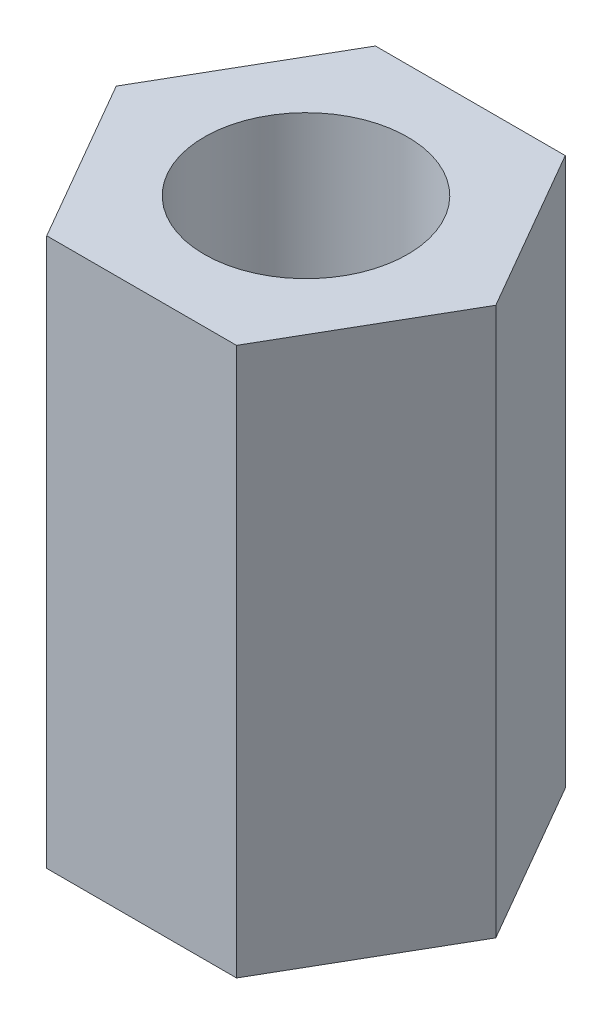
ISO-10303-21;
HEADER;
FILE_DESCRIPTION(('STEP AP214'),'2;1');
FILE_NAME('part.step','',(''),(''),'','','');
FILE_SCHEMA(('AUTOMOTIVE_DESIGN { 1 0 10303 214 1 1 1 1 }'));
ENDSEC;
DATA;
#1=APPLICATION_CONTEXT('core data for automotive mechanical design processes');
#2=APPLICATION_PROTOCOL_DEFINITION('international standard','automotive_design',2000,#1);
#3=PRODUCT_CONTEXT('',#1,'mechanical');
#4=PRODUCT('Part','Part','',(#3));
#5=PRODUCT_RELATED_PRODUCT_CATEGORY('part','',(#4));
#6=PRODUCT_DEFINITION_FORMATION('','',#4);
#7=PRODUCT_DEFINITION_CONTEXT('part definition',#1,'design');
#8=PRODUCT_DEFINITION('design','',#6,#7);
#9=PRODUCT_DEFINITION_SHAPE('','',#8);
#10=(LENGTH_UNIT() NAMED_UNIT(*) SI_UNIT(.MILLI.,.METRE.));
#11=(NAMED_UNIT(*) PLANE_ANGLE_UNIT() SI_UNIT($,.RADIAN.));
#12=(NAMED_UNIT(*) SI_UNIT($,.STERADIAN.) SOLID_ANGLE_UNIT());
#13=UNCERTAINTY_MEASURE_WITH_UNIT(LENGTH_MEASURE(1.E-05),#10,'distance_accuracy_value','');
#14=(GEOMETRIC_REPRESENTATION_CONTEXT(3) GLOBAL_UNCERTAINTY_ASSIGNED_CONTEXT((#13)) GLOBAL_UNIT_ASSIGNED_CONTEXT((#10,
#11,#12)) REPRESENTATION_CONTEXT('',''));
#15=CARTESIAN_POINT('',(0.,0.,0.));
#16=DIRECTION('',(0.,0.,1.));
#17=DIRECTION('',(1.,0.,0.));
#18=AXIS2_PLACEMENT_3D('',#15,#16,#17);
#19=CARTESIAN_POINT('',(1.37481532850778,7.9375,2.38125000000001));
#20=DIRECTION('',(-0.866025403784439,0.,-0.499999999999999));
#21=DIRECTION('',(-0.499999999999999,0.,0.866025403784439));
#22=AXIS2_PLACEMENT_3D('',#19,#20,#21);
#23=PLANE('',#22);
#24=DIRECTION('',(0.499999999999999,0.,-0.866025403784439));
#25=VECTOR('',#24,1.);
#26=CARTESIAN_POINT('',(1.37481532850778,0.,2.38125000000001));
#27=LINE('',#26,#25);
#28=CARTESIAN_POINT('',(1.37481532850778,0.,2.38125000000001));
#29=VERTEX_POINT('',#28);
#30=CARTESIAN_POINT('',(2.74963065701558,0.,0.));
#31=VERTEX_POINT('',#30);
#32=EDGE_CURVE('E117',#29,#31,#27,.T.);
#33=ORIENTED_EDGE('',*,*,#32,.T.);
#34=DIRECTION('',(0.,-1.,0.));
#35=VECTOR('',#34,1.);
#36=CARTESIAN_POINT('',(2.74963065701558,7.9375,0.));
#37=LINE('',#36,#35);
#38=CARTESIAN_POINT('',(2.74963065701558,7.9375,0.));
#39=VERTEX_POINT('',#38);
#40=EDGE_CURVE('E11',#39,#31,#37,.T.);
#41=ORIENTED_EDGE('',*,*,#40,.F.);
#42=DIRECTION('',(0.499999999999999,0.,-0.866025403784439));
#43=VECTOR('',#42,1.);
#44=CARTESIAN_POINT('',(1.37481532850778,7.9375,2.38125000000001));
#45=LINE('',#44,#43);
#46=CARTESIAN_POINT('',(1.37481532850778,7.9375,2.38125000000001));
#47=VERTEX_POINT('',#46);
#48=EDGE_CURVE('E128',#47,#39,#45,.T.);
#49=ORIENTED_EDGE('',*,*,#48,.F.);
#50=DIRECTION('',(0.,-1.,0.));
#51=VECTOR('',#50,1.);
#52=CARTESIAN_POINT('',(1.37481532850778,7.9375,2.38125000000001));
#53=LINE('',#52,#51);
#54=EDGE_CURVE('E113',#47,#29,#53,.T.);
#55=ORIENTED_EDGE('',*,*,#54,.T.);
#56=EDGE_LOOP('',(#33,#41,#49,#55));
#57=FACE_BOUND('',#56,.T.);
#58=ADVANCED_FACE('F33',(#57),#23,.F.);
#59=CARTESIAN_POINT('',(2.74963065701558,7.9375,0.));
#60=DIRECTION('',(-0.866025403784439,0.,0.5));
#61=DIRECTION('',(0.5,0.,0.866025403784439));
#62=AXIS2_PLACEMENT_3D('',#59,#60,#61);
#63=PLANE('',#62);
#64=DIRECTION('',(-0.5,0.,-0.866025403784439));
#65=VECTOR('',#64,1.);
#66=CARTESIAN_POINT('',(2.74963065701558,0.,0.));
#67=LINE('',#66,#65);
#68=CARTESIAN_POINT('',(1.37481532850778,0.,-2.38125000000002));
#69=VERTEX_POINT('',#68);
#70=EDGE_CURVE('E120',#31,#69,#67,.T.);
#71=ORIENTED_EDGE('',*,*,#70,.T.);
#72=DIRECTION('',(0.,-1.,0.));
#73=VECTOR('',#72,1.);
#74=CARTESIAN_POINT('',(1.37481532850778,7.9375,-2.38125000000002));
#75=LINE('',#74,#73);
#76=CARTESIAN_POINT('',(1.37481532850778,7.9375,-2.38125000000002));
#77=VERTEX_POINT('',#76);
#78=EDGE_CURVE('E41',#77,#69,#75,.T.);
#79=ORIENTED_EDGE('',*,*,#78,.F.);
#80=DIRECTION('',(-0.5,0.,-0.866025403784439));
#81=VECTOR('',#80,1.);
#82=CARTESIAN_POINT('',(2.74963065701558,7.9375,0.));
#83=LINE('',#82,#81);
#84=EDGE_CURVE('E86',#39,#77,#83,.T.);
#85=ORIENTED_EDGE('',*,*,#84,.F.);
#86=ORIENTED_EDGE('',*,*,#40,.T.);
#87=EDGE_LOOP('',(#71,#79,#85,#86));
#88=FACE_BOUND('',#87,.T.);
#89=ADVANCED_FACE('F153',(#88),#63,.F.);
#90=CARTESIAN_POINT('',(1.37481532850778,7.9375,-2.38125000000002));
#91=DIRECTION('',(0.,0.,1.));
#92=DIRECTION('',(1.,0.,0.));
#93=AXIS2_PLACEMENT_3D('',#90,#91,#92);
#94=PLANE('',#93);
#95=DIRECTION('',(-1.,0.,0.));
#96=VECTOR('',#95,1.);
#97=CARTESIAN_POINT('',(1.37481532850778,0.,-2.38125000000002));
#98=LINE('',#97,#96);
#99=CARTESIAN_POINT('',(-1.3748153285078,0.,-2.38125000000003));
#100=VERTEX_POINT('',#99);
#101=EDGE_CURVE('E123',#69,#100,#98,.T.);
#102=ORIENTED_EDGE('',*,*,#101,.T.);
#103=DIRECTION('',(0.,-1.,0.));
#104=VECTOR('',#103,1.);
#105=CARTESIAN_POINT('',(-1.3748153285078,7.9375,-2.38125000000003));
#106=LINE('',#105,#104);
#107=CARTESIAN_POINT('',(-1.3748153285078,7.9375,-2.38125000000003));
#108=VERTEX_POINT('',#107);
#109=EDGE_CURVE('E108',#108,#100,#106,.T.);
#110=ORIENTED_EDGE('',*,*,#109,.F.);
#111=DIRECTION('',(-1.,0.,0.));
#112=VECTOR('',#111,1.);
#113=CARTESIAN_POINT('',(1.37481532850778,7.9375,-2.38125000000002));
#114=LINE('',#113,#112);
#115=EDGE_CURVE('E99',#77,#108,#114,.T.);
#116=ORIENTED_EDGE('',*,*,#115,.F.);
#117=ORIENTED_EDGE('',*,*,#78,.T.);
#118=EDGE_LOOP('',(#102,#110,#116,#117));
#119=FACE_BOUND('',#118,.T.);
#120=ADVANCED_FACE('F134',(#119),#94,.F.);
#121=CARTESIAN_POINT('',(-1.3748153285078,7.9375,-2.38125000000003));
#122=DIRECTION('',(0.86602540378444,0.,0.499999999999999));
#123=DIRECTION('',(0.499999999999999,0.,-0.86602540378444));
#124=AXIS2_PLACEMENT_3D('',#121,#122,#123);
#125=PLANE('',#124);
#126=DIRECTION('',(-0.499999999999999,0.,0.866025403784439));
#127=VECTOR('',#126,1.);
#128=CARTESIAN_POINT('',(-1.3748153285078,0.,-2.38125000000003));
#129=LINE('',#128,#127);
#130=CARTESIAN_POINT('',(-2.7496306570156,0.,0.));
#131=VERTEX_POINT('',#130);
#132=EDGE_CURVE('E107',#100,#131,#129,.T.);
#133=ORIENTED_EDGE('',*,*,#132,.T.);
#134=DIRECTION('',(0.,-1.,0.));
#135=VECTOR('',#134,1.);
#136=CARTESIAN_POINT('',(-2.7496306570156,7.9375,0.));
#137=LINE('',#136,#135);
#138=CARTESIAN_POINT('',(-2.7496306570156,7.9375,0.));
#139=VERTEX_POINT('',#138);
#140=EDGE_CURVE('E104',#139,#131,#137,.T.);
#141=ORIENTED_EDGE('',*,*,#140,.F.);
#142=DIRECTION('',(-0.499999999999999,0.,0.866025403784439));
#143=VECTOR('',#142,1.);
#144=CARTESIAN_POINT('',(-1.3748153285078,7.9375,-2.38125000000003));
#145=LINE('',#144,#143);
#146=EDGE_CURVE('E93',#108,#139,#145,.T.);
#147=ORIENTED_EDGE('',*,*,#146,.F.);
#148=ORIENTED_EDGE('',*,*,#109,.T.);
#149=EDGE_LOOP('',(#133,#141,#147,#148));
#150=FACE_BOUND('',#149,.T.);
#151=ADVANCED_FACE('F105',(#150),#125,.F.);
#152=CARTESIAN_POINT('',(-2.7496306570156,7.9375,0.));
#153=DIRECTION('',(0.866025403784438,0.,-0.500000000000001));
#154=DIRECTION('',(-0.500000000000001,0.,-0.866025403784438));
#155=AXIS2_PLACEMENT_3D('',#152,#153,#154);
#156=PLANE('',#155);
#157=DIRECTION('',(0.500000000000001,0.,0.866025403784438));
#158=VECTOR('',#157,1.);
#159=CARTESIAN_POINT('',(-2.7496306570156,0.,0.));
#160=LINE('',#159,#158);
#161=CARTESIAN_POINT('',(-1.3748153285078,0.,2.38125000000001));
#162=VERTEX_POINT('',#161);
#163=EDGE_CURVE('E72',#131,#162,#160,.T.);
#164=ORIENTED_EDGE('',*,*,#163,.T.);
#165=DIRECTION('',(0.,-1.,0.));
#166=VECTOR('',#165,1.);
#167=CARTESIAN_POINT('',(-1.3748153285078,7.9375,2.38125000000001));
#168=LINE('',#167,#166);
#169=CARTESIAN_POINT('',(-1.3748153285078,7.9375,2.38125000000001));
#170=VERTEX_POINT('',#169);
#171=EDGE_CURVE('E109',#170,#162,#168,.T.);
#172=ORIENTED_EDGE('',*,*,#171,.F.);
#173=DIRECTION('',(0.500000000000001,0.,0.866025403784438));
#174=VECTOR('',#173,1.);
#175=CARTESIAN_POINT('',(-2.7496306570156,7.9375,0.));
#176=LINE('',#175,#174);
#177=EDGE_CURVE('E97',#139,#170,#176,.T.);
#178=ORIENTED_EDGE('',*,*,#177,.F.);
#179=ORIENTED_EDGE('',*,*,#140,.T.);
#180=EDGE_LOOP('',(#164,#172,#178,#179));
#181=FACE_BOUND('',#180,.T.);
#182=ADVANCED_FACE('F111',(#181),#156,.F.);
#183=CARTESIAN_POINT('',(-1.3748153285078,7.9375,2.38125000000001));
#184=DIRECTION('',(0.,0.,-1.));
#185=DIRECTION('',(-1.,0.,0.));
#186=AXIS2_PLACEMENT_3D('',#183,#184,#185);
#187=PLANE('',#186);
#188=DIRECTION('',(1.,0.,0.));
#189=VECTOR('',#188,1.);
#190=CARTESIAN_POINT('',(-1.3748153285078,0.,2.38125000000001));
#191=LINE('',#190,#189);
#192=EDGE_CURVE('E78',#162,#29,#191,.T.);
#193=ORIENTED_EDGE('',*,*,#192,.T.);
#194=ORIENTED_EDGE('',*,*,#54,.F.);
#195=DIRECTION('',(1.,0.,0.));
#196=VECTOR('',#195,1.);
#197=CARTESIAN_POINT('',(-1.3748153285078,7.9375,2.38125000000001));
#198=LINE('',#197,#196);
#199=EDGE_CURVE('E49',#170,#47,#198,.T.);
#200=ORIENTED_EDGE('',*,*,#199,.F.);
#201=ORIENTED_EDGE('',*,*,#171,.T.);
#202=EDGE_LOOP('',(#193,#194,#200,#201));
#203=FACE_BOUND('',#202,.T.);
#204=ADVANCED_FACE('F141',(#203),#187,.F.);
#205=CARTESIAN_POINT('',(0.,7.9375,0.));
#206=DIRECTION('',(0.,1.,0.));
#207=DIRECTION('',(0.,0.,1.));
#208=AXIS2_PLACEMENT_3D('',#205,#206,#207);
#209=PLANE('',#208);
#210=CARTESIAN_POINT('',(0.,7.9375,0.));
#211=DIRECTION('',(0.,1.,0.));
#212=DIRECTION('',(0.,0.,1.));
#213=AXIS2_PLACEMENT_3D('',#210,#211,#212);
#214=CIRCLE('',#213,1.4732);
#215=CARTESIAN_POINT('',(0.,7.9375,1.4732));
#216=VERTEX_POINT('',#215);
#217=EDGE_CURVE('E206',#216,#216,#214,.T.);
#218=ORIENTED_EDGE('',*,*,#217,.F.);
#219=EDGE_LOOP('',(#218));
#220=FACE_BOUND('',#219,.T.);
#221=ORIENTED_EDGE('',*,*,#48,.T.);
#222=ORIENTED_EDGE('',*,*,#84,.T.);
#223=ORIENTED_EDGE('',*,*,#115,.T.);
#224=ORIENTED_EDGE('',*,*,#146,.T.);
#225=ORIENTED_EDGE('',*,*,#177,.T.);
#226=ORIENTED_EDGE('',*,*,#199,.T.);
#227=EDGE_LOOP('',(#221,#222,#223,#224,#225,#226));
#228=FACE_BOUND('',#227,.T.);
#229=ADVANCED_FACE('F95',(#220,#228),#209,.T.);
#230=CARTESIAN_POINT('',(0.,0.,0.));
#231=DIRECTION('',(0.,1.,0.));
#232=DIRECTION('',(0.,0.,1.));
#233=AXIS2_PLACEMENT_3D('',#230,#231,#232);
#234=PLANE('',#233);
#235=CARTESIAN_POINT('',(0.,0.,0.));
#236=DIRECTION('',(0.,1.,0.));
#237=DIRECTION('',(0.,0.,1.));
#238=AXIS2_PLACEMENT_3D('',#235,#236,#237);
#239=CIRCLE('',#238,1.4732);
#240=CARTESIAN_POINT('',(0.,0.,1.4732));
#241=VERTEX_POINT('',#240);
#242=EDGE_CURVE('E121',#241,#241,#239,.T.);
#243=ORIENTED_EDGE('',*,*,#242,.T.);
#244=EDGE_LOOP('',(#243));
#245=FACE_BOUND('',#244,.T.);
#246=ORIENTED_EDGE('',*,*,#32,.F.);
#247=ORIENTED_EDGE('',*,*,#192,.F.);
#248=ORIENTED_EDGE('',*,*,#163,.F.);
#249=ORIENTED_EDGE('',*,*,#132,.F.);
#250=ORIENTED_EDGE('',*,*,#101,.F.);
#251=ORIENTED_EDGE('',*,*,#70,.F.);
#252=EDGE_LOOP('',(#246,#247,#248,#249,#250,#251));
#253=FACE_BOUND('',#252,.T.);
#254=ADVANCED_FACE('F137',(#245,#253),#234,.F.);
#255=CARTESIAN_POINT('',(0.,7.9375,0.));
#256=DIRECTION('',(0.,1.,0.));
#257=DIRECTION('',(0.,0.,1.));
#258=AXIS2_PLACEMENT_3D('',#255,#256,#257);
#259=CYLINDRICAL_SURFACE('',#258,1.4732);
#260=ORIENTED_EDGE('',*,*,#217,.T.);
#261=EDGE_LOOP('',(#260));
#262=FACE_BOUND('',#261,.T.);
#263=ORIENTED_EDGE('',*,*,#242,.F.);
#264=EDGE_LOOP('',(#263));
#265=FACE_BOUND('',#264,.T.);
#266=ADVANCED_FACE('F190',(#262,#265),#259,.F.);
#267=CLOSED_SHELL('',(#58,#89,#120,#151,#182,#204,#229,#254,#266));
#268=MANIFOLD_SOLID_BREP('B2',#267);
#269=ADVANCED_BREP_SHAPE_REPRESENTATION('',(#18,#268),#14);
#270=SHAPE_DEFINITION_REPRESENTATION(#9,#269);
ENDSEC;
END-ISO-10303-21;
